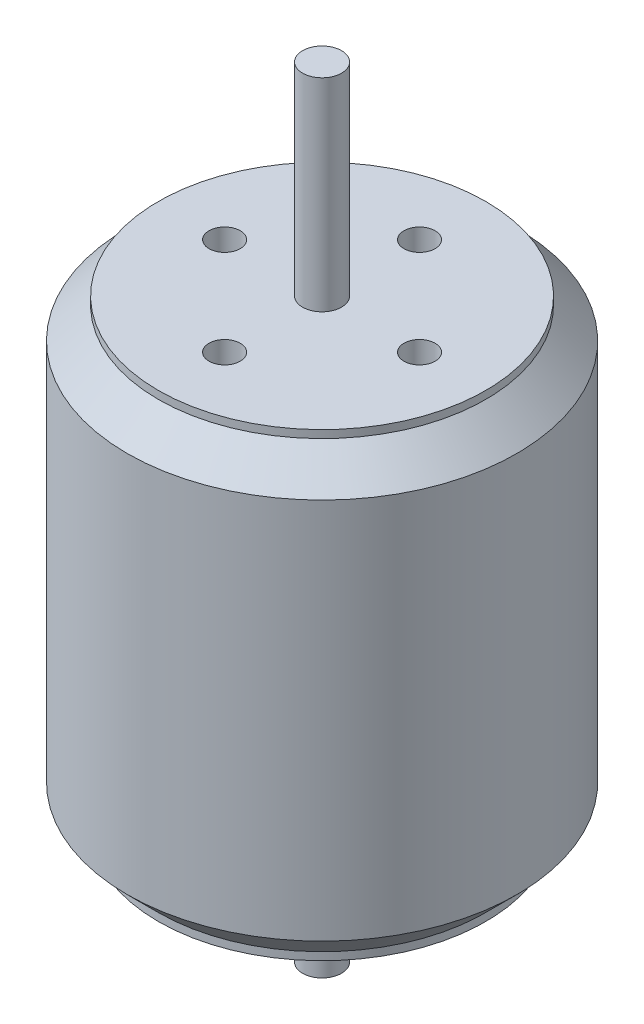
ISO-10303-21;
HEADER;
FILE_DESCRIPTION(('STEP AP214'),'2;1');
FILE_NAME('part.step','',(''),(''),'','','');
FILE_SCHEMA(('AUTOMOTIVE_DESIGN { 1 0 10303 214 1 1 1 1 }'));
ENDSEC;
DATA;
#1=APPLICATION_CONTEXT('core data for automotive mechanical design processes');
#2=APPLICATION_PROTOCOL_DEFINITION('international standard','automotive_design',2000,#1);
#3=PRODUCT_CONTEXT('',#1,'mechanical');
#4=PRODUCT('Part','Part','',(#3));
#5=PRODUCT_RELATED_PRODUCT_CATEGORY('part','',(#4));
#6=PRODUCT_DEFINITION_FORMATION('','',#4);
#7=PRODUCT_DEFINITION_CONTEXT('part definition',#1,'design');
#8=PRODUCT_DEFINITION('design','',#6,#7);
#9=PRODUCT_DEFINITION_SHAPE('','',#8);
#10=(LENGTH_UNIT() NAMED_UNIT(*) SI_UNIT(.MILLI.,.METRE.));
#11=(NAMED_UNIT(*) PLANE_ANGLE_UNIT() SI_UNIT($,.RADIAN.));
#12=(NAMED_UNIT(*) SI_UNIT($,.STERADIAN.) SOLID_ANGLE_UNIT());
#13=UNCERTAINTY_MEASURE_WITH_UNIT(LENGTH_MEASURE(1.E-05),#10,'distance_accuracy_value','');
#14=(GEOMETRIC_REPRESENTATION_CONTEXT(3) GLOBAL_UNCERTAINTY_ASSIGNED_CONTEXT((#13)) GLOBAL_UNIT_ASSIGNED_CONTEXT((#10,
#11,#12)) REPRESENTATION_CONTEXT('',''));
#15=CARTESIAN_POINT('',(0.,0.,0.));
#16=DIRECTION('',(0.,0.,1.));
#17=DIRECTION('',(1.,0.,0.));
#18=AXIS2_PLACEMENT_3D('',#15,#16,#17);
#19=CARTESIAN_POINT('',(0.,-59.,0.));
#20=DIRECTION('',(0.,1.,0.));
#21=DIRECTION('',(0.,0.,1.));
#22=AXIS2_PLACEMENT_3D('',#19,#20,#21);
#23=CYLINDRICAL_SURFACE('',#22,21.);
#24=CARTESIAN_POINT('',(0.,-0.99999999999998,0.));
#25=DIRECTION('',(0.,1.,0.));
#26=DIRECTION('',(0.,0.,1.));
#27=AXIS2_PLACEMENT_3D('',#24,#25,#26);
#28=CIRCLE('',#27,21.);
#29=CARTESIAN_POINT('',(0.,-0.99999999999998,21.));
#30=VERTEX_POINT('',#29);
#31=EDGE_CURVE('E44',#30,#30,#28,.T.);
#32=ORIENTED_EDGE('',*,*,#31,.T.);
#33=EDGE_LOOP('',(#32));
#34=FACE_BOUND('',#33,.T.);
#35=CARTESIAN_POINT('',(0.,0.,0.));
#36=DIRECTION('',(0.,1.,0.));
#37=DIRECTION('',(0.,0.,1.));
#38=AXIS2_PLACEMENT_3D('',#35,#36,#37);
#39=CIRCLE('',#38,21.);
#40=CARTESIAN_POINT('',(0.,0.,21.));
#41=VERTEX_POINT('',#40);
#42=EDGE_CURVE('E52',#41,#41,#39,.T.);
#43=ORIENTED_EDGE('',*,*,#42,.F.);
#44=EDGE_LOOP('',(#43));
#45=FACE_BOUND('',#44,.T.);
#46=ADVANCED_FACE('F37',(#34,#45),#23,.T.);
#47=CARTESIAN_POINT('',(0.,0.,0.));
#48=DIRECTION('',(0.,1.,0.));
#49=DIRECTION('',(0.,0.,1.));
#50=AXIS2_PLACEMENT_3D('',#47,#48,#49);
#51=PLANE('',#50);
#52=CARTESIAN_POINT('',(-12.5,0.,0.));
#53=DIRECTION('',(0.,1.,0.));
#54=DIRECTION('',(0.,0.,1.));
#55=AXIS2_PLACEMENT_3D('',#52,#53,#54);
#56=CIRCLE('',#55,2.);
#57=CARTESIAN_POINT('',(-12.5,0.,2.));
#58=VERTEX_POINT('',#57);
#59=EDGE_CURVE('E83',#58,#58,#56,.T.);
#60=ORIENTED_EDGE('',*,*,#59,.F.);
#61=EDGE_LOOP('',(#60));
#62=FACE_BOUND('',#61,.T.);
#63=CARTESIAN_POINT('',(0.,0.,-12.5));
#64=DIRECTION('',(0.,1.,0.));
#65=DIRECTION('',(0.,0.,1.));
#66=AXIS2_PLACEMENT_3D('',#63,#64,#65);
#67=CIRCLE('',#66,2.);
#68=CARTESIAN_POINT('',(0.,0.,-10.5));
#69=VERTEX_POINT('',#68);
#70=EDGE_CURVE('E77',#69,#69,#67,.T.);
#71=ORIENTED_EDGE('',*,*,#70,.F.);
#72=EDGE_LOOP('',(#71));
#73=FACE_BOUND('',#72,.T.);
#74=CARTESIAN_POINT('',(12.5,0.,0.));
#75=DIRECTION('',(0.,1.,0.));
#76=DIRECTION('',(0.,0.,1.));
#77=AXIS2_PLACEMENT_3D('',#74,#75,#76);
#78=CIRCLE('',#77,2.);
#79=CARTESIAN_POINT('',(12.5,0.,1.99999999999999));
#80=VERTEX_POINT('',#79);
#81=EDGE_CURVE('E71',#80,#80,#78,.T.);
#82=ORIENTED_EDGE('',*,*,#81,.F.);
#83=EDGE_LOOP('',(#82));
#84=FACE_BOUND('',#83,.T.);
#85=CARTESIAN_POINT('',(0.,0.,12.5));
#86=DIRECTION('',(0.,1.,0.));
#87=DIRECTION('',(0.,0.,1.));
#88=AXIS2_PLACEMENT_3D('',#85,#86,#87);
#89=CIRCLE('',#88,2.);
#90=CARTESIAN_POINT('',(0.,0.,14.5));
#91=VERTEX_POINT('',#90);
#92=EDGE_CURVE('E64',#91,#91,#89,.T.);
#93=ORIENTED_EDGE('',*,*,#92,.F.);
#94=EDGE_LOOP('',(#93));
#95=FACE_BOUND('',#94,.T.);
#96=CARTESIAN_POINT('',(0.,0.,0.));
#97=DIRECTION('',(0.,1.,0.));
#98=DIRECTION('',(0.,0.,1.));
#99=AXIS2_PLACEMENT_3D('',#96,#97,#98);
#100=CIRCLE('',#99,2.5);
#101=CARTESIAN_POINT('',(0.,0.,-2.5));
#102=VERTEX_POINT('',#101);
#103=EDGE_CURVE('E58',#102,#102,#100,.T.);
#104=ORIENTED_EDGE('',*,*,#103,.F.);
#105=EDGE_LOOP('',(#104));
#106=FACE_BOUND('',#105,.T.);
#107=ORIENTED_EDGE('',*,*,#42,.T.);
#108=EDGE_LOOP('',(#107));
#109=FACE_BOUND('',#108,.T.);
#110=ADVANCED_FACE('F111',(#62,#73,#84,#95,#106,#109),#51,.T.);
#111=CARTESIAN_POINT('',(0.,26.,0.));
#112=DIRECTION('',(0.,-1.,0.));
#113=DIRECTION('',(0.,0.,-1.));
#114=AXIS2_PLACEMENT_3D('',#111,#112,#113);
#115=CYLINDRICAL_SURFACE('',#114,2.5);
#116=CARTESIAN_POINT('',(0.,26.,0.));
#117=DIRECTION('',(0.,1.,0.));
#118=DIRECTION('',(0.,0.,1.));
#119=AXIS2_PLACEMENT_3D('',#116,#117,#118);
#120=CIRCLE('',#119,2.5);
#121=CARTESIAN_POINT('',(0.,26.,-2.5));
#122=VERTEX_POINT('',#121);
#123=EDGE_CURVE('E56',#122,#122,#120,.T.);
#124=CARTESIAN_POINT('',(0.,26.,-2.5));
#125=CARTESIAN_POINT('',(0.,25.7291666666667,-2.5));
#126=CARTESIAN_POINT('',(0.,25.4583333333333,-2.5));
#127=CARTESIAN_POINT('',(0.,24.9166666666667,-2.5));
#128=CARTESIAN_POINT('',(0.,24.6458333333333,-2.5));
#129=CARTESIAN_POINT('',(0.,24.1041666666667,-2.5));
#130=CARTESIAN_POINT('',(0.,23.8333333333333,-2.5));
#131=CARTESIAN_POINT('',(0.,23.2916666666667,-2.5));
#132=CARTESIAN_POINT('',(0.,23.0208333333333,-2.5));
#133=CARTESIAN_POINT('',(0.,22.4791666666667,-2.5));
#134=CARTESIAN_POINT('',(0.,22.2083333333333,-2.5));
#135=CARTESIAN_POINT('',(0.,21.6666666666667,-2.5));
#136=CARTESIAN_POINT('',(0.,21.3958333333333,-2.5));
#137=CARTESIAN_POINT('',(0.,20.8541666666667,-2.5));
#138=CARTESIAN_POINT('',(0.,20.5833333333333,-2.5));
#139=CARTESIAN_POINT('',(0.,20.0416666666667,-2.5));
#140=CARTESIAN_POINT('',(0.,19.7708333333333,-2.5));
#141=CARTESIAN_POINT('',(0.,19.2291666666667,-2.5));
#142=CARTESIAN_POINT('',(0.,18.9583333333333,-2.5));
#143=CARTESIAN_POINT('',(0.,18.4166666666667,-2.5));
#144=CARTESIAN_POINT('',(0.,18.1458333333333,-2.5));
#145=CARTESIAN_POINT('',(0.,17.6041666666667,-2.5));
#146=CARTESIAN_POINT('',(0.,17.3333333333333,-2.5));
#147=CARTESIAN_POINT('',(0.,16.7916666666667,-2.5));
#148=CARTESIAN_POINT('',(0.,16.5208333333333,-2.5));
#149=CARTESIAN_POINT('',(0.,15.9791666666667,-2.5));
#150=CARTESIAN_POINT('',(0.,15.7083333333333,-2.5));
#151=CARTESIAN_POINT('',(0.,15.1666666666667,-2.5));
#152=CARTESIAN_POINT('',(0.,14.8958333333333,-2.5));
#153=CARTESIAN_POINT('',(0.,14.3541666666667,-2.5));
#154=CARTESIAN_POINT('',(0.,14.0833333333333,-2.5));
#155=CARTESIAN_POINT('',(0.,13.5416666666667,-2.5));
#156=CARTESIAN_POINT('',(0.,13.2708333333333,-2.5));
#157=CARTESIAN_POINT('',(0.,12.7291666666667,-2.5));
#158=CARTESIAN_POINT('',(0.,12.4583333333333,-2.5));
#159=CARTESIAN_POINT('',(0.,11.9166666666667,-2.5));
#160=CARTESIAN_POINT('',(0.,11.6458333333333,-2.5));
#161=CARTESIAN_POINT('',(0.,11.1041666666667,-2.5));
#162=CARTESIAN_POINT('',(0.,10.8333333333333,-2.5));
#163=CARTESIAN_POINT('',(0.,10.2916666666667,-2.5));
#164=CARTESIAN_POINT('',(0.,10.0208333333333,-2.5));
#165=CARTESIAN_POINT('',(0.,9.47916666666667,-2.5));
#166=CARTESIAN_POINT('',(0.,9.20833333333333,-2.5));
#167=CARTESIAN_POINT('',(0.,8.66666666666667,-2.5));
#168=CARTESIAN_POINT('',(0.,8.39583333333333,-2.5));
#169=CARTESIAN_POINT('',(0.,7.85416666666667,-2.5));
#170=CARTESIAN_POINT('',(0.,7.58333333333333,-2.5));
#171=CARTESIAN_POINT('',(0.,7.04166666666667,-2.5));
#172=CARTESIAN_POINT('',(0.,6.77083333333333,-2.5));
#173=CARTESIAN_POINT('',(0.,6.22916666666667,-2.5));
#174=CARTESIAN_POINT('',(0.,5.95833333333333,-2.5));
#175=CARTESIAN_POINT('',(0.,5.41666666666667,-2.5));
#176=CARTESIAN_POINT('',(0.,5.14583333333333,-2.5));
#177=CARTESIAN_POINT('',(0.,4.60416666666667,-2.5));
#178=CARTESIAN_POINT('',(0.,4.33333333333333,-2.5));
#179=CARTESIAN_POINT('',(0.,3.79166666666667,-2.5));
#180=CARTESIAN_POINT('',(0.,3.52083333333333,-2.5));
#181=CARTESIAN_POINT('',(0.,2.97916666666667,-2.5));
#182=CARTESIAN_POINT('',(0.,2.70833333333333,-2.5));
#183=CARTESIAN_POINT('',(0.,2.16666666666667,-2.5));
#184=CARTESIAN_POINT('',(0.,1.89583333333333,-2.5));
#185=CARTESIAN_POINT('',(0.,1.35416666666667,-2.5));
#186=CARTESIAN_POINT('',(0.,1.08333333333333,-2.5));
#187=CARTESIAN_POINT('',(0.,0.541666666666667,-2.5));
#188=CARTESIAN_POINT('',(0.,0.270833333333334,-2.5));
#189=CARTESIAN_POINT('',(0.,0.,-2.5));
#190=B_SPLINE_CURVE_WITH_KNOTS('',3,(#124,#125,#126,#127,#128,#129,#130,#131,#132,#133,#134,
#135,#136,#137,#138,#139,#140,#141,#142,#143,#144,#145,#146,#147,#148,#149,#150,#151,#152,#153,
#154,#155,#156,#157,#158,#159,#160,#161,#162,#163,#164,#165,#166,#167,#168,#169,#170,#171,#172,
#173,#174,#175,#176,#177,#178,#179,#180,#181,#182,#183,#184,#185,#186,#187,#188,#189),
.UNSPECIFIED.,.F.,.F.,(4,2,2,2,2,2,2,2,2,2,2,2,2,2,2,2,2,2,2,2,2,2,2,2,2,2,2,2,2,2,2,2,4),(0.,
0.812500000000001,1.625,2.4375,3.25,4.0625,4.875,5.6875,6.5,7.3125,8.125,8.9375,9.75,10.5625,
11.375,12.1875,13.,13.8125,14.625,15.4375,16.25,17.0625,17.875,18.6875,19.5,20.3125,21.125,
21.9375,22.75,23.5625,24.375,25.1875,26.),.UNSPECIFIED.);
#191=EDGE_CURVE('BSEAM117',#122,#102,#190,.T.);
#192=ORIENTED_EDGE('',*,*,#123,.F.);
#193=ORIENTED_EDGE('',*,*,#103,.T.);
#194=ORIENTED_EDGE('',*,*,#191,.T.);
#195=ORIENTED_EDGE('',*,*,#191,.F.);
#196=EDGE_LOOP('',(#192,#194,#193,#195));
#197=FACE_BOUND('',#196,.T.);
#198=ADVANCED_FACE('F117',(#197),#115,.T.);
#199=CARTESIAN_POINT('',(0.,26.,0.));
#200=DIRECTION('',(0.,1.,0.));
#201=DIRECTION('',(0.,0.,1.));
#202=AXIS2_PLACEMENT_3D('',#199,#200,#201);
#203=PLANE('',#202);
#204=ORIENTED_EDGE('',*,*,#123,.T.);
#205=EDGE_LOOP('',(#204));
#206=FACE_BOUND('',#205,.T.);
#207=ADVANCED_FACE('F146',(#206),#203,.T.);
#208=CARTESIAN_POINT('',(0.,-10.,12.5));
#209=DIRECTION('',(0.,1.,0.));
#210=DIRECTION('',(0.,0.,1.));
#211=AXIS2_PLACEMENT_3D('',#208,#209,#210);
#212=CYLINDRICAL_SURFACE('',#211,2.);
#213=CARTESIAN_POINT('',(0.,-10.,12.5));
#214=DIRECTION('',(0.,1.,0.));
#215=DIRECTION('',(0.,0.,1.));
#216=AXIS2_PLACEMENT_3D('',#213,#214,#215);
#217=CIRCLE('',#216,2.);
#218=CARTESIAN_POINT('',(0.,-10.,14.5));
#219=VERTEX_POINT('',#218);
#220=EDGE_CURVE('E67',#219,#219,#217,.T.);
#221=ORIENTED_EDGE('',*,*,#220,.F.);
#222=EDGE_LOOP('',(#221));
#223=FACE_BOUND('',#222,.T.);
#224=ORIENTED_EDGE('',*,*,#92,.T.);
#225=EDGE_LOOP('',(#224));
#226=FACE_BOUND('',#225,.T.);
#227=ADVANCED_FACE('F150',(#223,#226),#212,.F.);
#228=CARTESIAN_POINT('',(0.,-10.,0.));
#229=DIRECTION('',(0.,1.,0.));
#230=DIRECTION('',(0.,0.,1.));
#231=AXIS2_PLACEMENT_3D('',#228,#229,#230);
#232=PLANE('',#231);
#233=ORIENTED_EDGE('',*,*,#220,.T.);
#234=EDGE_LOOP('',(#233));
#235=FACE_BOUND('',#234,.T.);
#236=ADVANCED_FACE('F154',(#235),#232,.T.);
#237=CARTESIAN_POINT('',(12.5,-10.,0.));
#238=DIRECTION('',(0.,1.,0.));
#239=DIRECTION('',(0.,0.,1.));
#240=AXIS2_PLACEMENT_3D('',#237,#238,#239);
#241=CYLINDRICAL_SURFACE('',#240,2.);
#242=CARTESIAN_POINT('',(12.5,-10.,0.));
#243=DIRECTION('',(0.,1.,0.));
#244=DIRECTION('',(0.,0.,1.));
#245=AXIS2_PLACEMENT_3D('',#242,#243,#244);
#246=CIRCLE('',#245,2.);
#247=CARTESIAN_POINT('',(12.5,-10.,1.99999999999999));
#248=VERTEX_POINT('',#247);
#249=EDGE_CURVE('E74',#248,#248,#246,.T.);
#250=ORIENTED_EDGE('',*,*,#249,.F.);
#251=EDGE_LOOP('',(#250));
#252=FACE_BOUND('',#251,.T.);
#253=ORIENTED_EDGE('',*,*,#81,.T.);
#254=EDGE_LOOP('',(#253));
#255=FACE_BOUND('',#254,.T.);
#256=ADVANCED_FACE('F158',(#252,#255),#241,.F.);
#257=CARTESIAN_POINT('',(0.,-10.,0.));
#258=DIRECTION('',(0.,1.,0.));
#259=DIRECTION('',(0.,0.,1.));
#260=AXIS2_PLACEMENT_3D('',#257,#258,#259);
#261=PLANE('',#260);
#262=ORIENTED_EDGE('',*,*,#249,.T.);
#263=EDGE_LOOP('',(#262));
#264=FACE_BOUND('',#263,.T.);
#265=ADVANCED_FACE('F162',(#264),#261,.T.);
#266=CARTESIAN_POINT('',(0.,-10.,-12.5));
#267=DIRECTION('',(0.,1.,0.));
#268=DIRECTION('',(0.,0.,1.));
#269=AXIS2_PLACEMENT_3D('',#266,#267,#268);
#270=CYLINDRICAL_SURFACE('',#269,2.);
#271=CARTESIAN_POINT('',(0.,-10.,-12.5));
#272=DIRECTION('',(0.,1.,0.));
#273=DIRECTION('',(0.,0.,1.));
#274=AXIS2_PLACEMENT_3D('',#271,#272,#273);
#275=CIRCLE('',#274,2.);
#276=CARTESIAN_POINT('',(0.,-10.,-10.5));
#277=VERTEX_POINT('',#276);
#278=EDGE_CURVE('E80',#277,#277,#275,.T.);
#279=ORIENTED_EDGE('',*,*,#278,.F.);
#280=EDGE_LOOP('',(#279));
#281=FACE_BOUND('',#280,.T.);
#282=ORIENTED_EDGE('',*,*,#70,.T.);
#283=EDGE_LOOP('',(#282));
#284=FACE_BOUND('',#283,.T.);
#285=ADVANCED_FACE('F166',(#281,#284),#270,.F.);
#286=CARTESIAN_POINT('',(0.,-10.,0.));
#287=DIRECTION('',(0.,1.,0.));
#288=DIRECTION('',(0.,0.,1.));
#289=AXIS2_PLACEMENT_3D('',#286,#287,#288);
#290=PLANE('',#289);
#291=ORIENTED_EDGE('',*,*,#278,.T.);
#292=EDGE_LOOP('',(#291));
#293=FACE_BOUND('',#292,.T.);
#294=ADVANCED_FACE('F170',(#293),#290,.T.);
#295=CARTESIAN_POINT('',(-12.5,-10.,0.));
#296=DIRECTION('',(0.,1.,0.));
#297=DIRECTION('',(0.,0.,1.));
#298=AXIS2_PLACEMENT_3D('',#295,#296,#297);
#299=CYLINDRICAL_SURFACE('',#298,2.);
#300=CARTESIAN_POINT('',(-12.5,-10.,0.));
#301=DIRECTION('',(0.,1.,0.));
#302=DIRECTION('',(0.,0.,1.));
#303=AXIS2_PLACEMENT_3D('',#300,#301,#302);
#304=CIRCLE('',#303,2.);
#305=CARTESIAN_POINT('',(-12.5,-10.,2.));
#306=VERTEX_POINT('',#305);
#307=EDGE_CURVE('E61',#306,#306,#304,.T.);
#308=ORIENTED_EDGE('',*,*,#307,.F.);
#309=EDGE_LOOP('',(#308));
#310=FACE_BOUND('',#309,.T.);
#311=ORIENTED_EDGE('',*,*,#59,.T.);
#312=EDGE_LOOP('',(#311));
#313=FACE_BOUND('',#312,.T.);
#314=ADVANCED_FACE('F174',(#310,#313),#299,.F.);
#315=CARTESIAN_POINT('',(0.,-10.,0.));
#316=DIRECTION('',(0.,1.,0.));
#317=DIRECTION('',(0.,0.,1.));
#318=AXIS2_PLACEMENT_3D('',#315,#316,#317);
#319=PLANE('',#318);
#320=ORIENTED_EDGE('',*,*,#307,.T.);
#321=EDGE_LOOP('',(#320));
#322=FACE_BOUND('',#321,.T.);
#323=ADVANCED_FACE('F140',(#322),#319,.T.);
#324=CARTESIAN_POINT('',(0.,-129.710678118655,0.));
#325=DIRECTION('',(0.,1.,0.));
#326=DIRECTION('',(0.,0.,1.));
#327=AXIS2_PLACEMENT_3D('',#324,#325,#326);
#328=CYLINDRICAL_SURFACE('',#327,25.);
#329=CARTESIAN_POINT('',(0.,-54.,0.));
#330=DIRECTION('',(0.,1.,0.));
#331=DIRECTION('',(0.,0.,1.));
#332=AXIS2_PLACEMENT_3D('',#329,#330,#331);
#333=CIRCLE('',#332,25.);
#334=CARTESIAN_POINT('',(0.,-54.,25.));
#335=VERTEX_POINT('',#334);
#336=EDGE_CURVE('E68',#335,#335,#333,.F.);
#337=CARTESIAN_POINT('',(0.,-5.,0.));
#338=DIRECTION('',(0.,1.,0.));
#339=DIRECTION('',(0.,0.,1.));
#340=AXIS2_PLACEMENT_3D('',#337,#338,#339);
#341=CIRCLE('',#340,25.);
#342=CARTESIAN_POINT('',(0.,-4.99999999999999,25.));
#343=VERTEX_POINT('',#342);
#344=EDGE_CURVE('E90',#343,#343,#341,.T.);
#345=CARTESIAN_POINT('',(0.,-54.,25.));
#346=CARTESIAN_POINT('',(0.,-53.4895833333333,25.));
#347=CARTESIAN_POINT('',(0.,-52.9791666666667,25.));
#348=CARTESIAN_POINT('',(0.,-51.9583333333333,25.));
#349=CARTESIAN_POINT('',(0.,-51.4479166666667,25.));
#350=CARTESIAN_POINT('',(0.,-50.4270833333333,25.));
#351=CARTESIAN_POINT('',(0.,-49.9166666666667,25.));
#352=CARTESIAN_POINT('',(0.,-48.8958333333333,25.));
#353=CARTESIAN_POINT('',(0.,-48.3854166666667,25.));
#354=CARTESIAN_POINT('',(0.,-47.3645833333333,25.));
#355=CARTESIAN_POINT('',(0.,-46.8541666666667,25.));
#356=CARTESIAN_POINT('',(0.,-45.8333333333333,25.));
#357=CARTESIAN_POINT('',(0.,-45.3229166666667,25.));
#358=CARTESIAN_POINT('',(0.,-44.3020833333333,25.));
#359=CARTESIAN_POINT('',(0.,-43.7916666666667,25.));
#360=CARTESIAN_POINT('',(0.,-42.7708333333333,25.));
#361=CARTESIAN_POINT('',(0.,-42.2604166666667,25.));
#362=CARTESIAN_POINT('',(0.,-41.2395833333333,25.));
#363=CARTESIAN_POINT('',(0.,-40.7291666666667,25.));
#364=CARTESIAN_POINT('',(0.,-39.7083333333333,25.));
#365=CARTESIAN_POINT('',(0.,-39.1979166666667,25.));
#366=CARTESIAN_POINT('',(0.,-38.1770833333333,25.));
#367=CARTESIAN_POINT('',(0.,-37.6666666666667,25.));
#368=CARTESIAN_POINT('',(0.,-36.6458333333333,25.));
#369=CARTESIAN_POINT('',(0.,-36.1354166666667,25.));
#370=CARTESIAN_POINT('',(0.,-35.1145833333333,25.));
#371=CARTESIAN_POINT('',(0.,-34.6041666666667,25.));
#372=CARTESIAN_POINT('',(0.,-33.5833333333333,25.));
#373=CARTESIAN_POINT('',(0.,-33.0729166666667,25.));
#374=CARTESIAN_POINT('',(0.,-32.0520833333333,25.));
#375=CARTESIAN_POINT('',(0.,-31.5416666666667,25.));
#376=CARTESIAN_POINT('',(0.,-30.5208333333333,25.));
#377=CARTESIAN_POINT('',(0.,-30.0104166666667,25.));
#378=CARTESIAN_POINT('',(0.,-28.9895833333333,25.));
#379=CARTESIAN_POINT('',(0.,-28.4791666666667,25.));
#380=CARTESIAN_POINT('',(0.,-27.4583333333333,25.));
#381=CARTESIAN_POINT('',(0.,-26.9479166666667,25.));
#382=CARTESIAN_POINT('',(0.,-25.9270833333333,25.));
#383=CARTESIAN_POINT('',(0.,-25.4166666666667,25.));
#384=CARTESIAN_POINT('',(0.,-24.3958333333333,25.));
#385=CARTESIAN_POINT('',(0.,-23.8854166666667,25.));
#386=CARTESIAN_POINT('',(0.,-22.8645833333333,25.));
#387=CARTESIAN_POINT('',(0.,-22.3541666666667,25.));
#388=CARTESIAN_POINT('',(0.,-21.3333333333333,25.));
#389=CARTESIAN_POINT('',(0.,-20.8229166666667,25.));
#390=CARTESIAN_POINT('',(0.,-19.8020833333333,25.));
#391=CARTESIAN_POINT('',(0.,-19.2916666666667,25.));
#392=CARTESIAN_POINT('',(0.,-18.2708333333333,25.));
#393=CARTESIAN_POINT('',(0.,-17.7604166666667,25.));
#394=CARTESIAN_POINT('',(0.,-16.7395833333333,25.));
#395=CARTESIAN_POINT('',(0.,-16.2291666666667,25.));
#396=CARTESIAN_POINT('',(0.,-15.2083333333333,25.));
#397=CARTESIAN_POINT('',(0.,-14.6979166666667,25.));
#398=CARTESIAN_POINT('',(0.,-13.6770833333333,25.));
#399=CARTESIAN_POINT('',(0.,-13.1666666666667,25.));
#400=CARTESIAN_POINT('',(0.,-12.1458333333333,25.));
#401=CARTESIAN_POINT('',(0.,-11.6354166666667,25.));
#402=CARTESIAN_POINT('',(0.,-10.6145833333333,25.));
#403=CARTESIAN_POINT('',(0.,-10.1041666666667,25.));
#404=CARTESIAN_POINT('',(0.,-9.08333333333333,25.));
#405=CARTESIAN_POINT('',(0.,-8.57291666666666,25.));
#406=CARTESIAN_POINT('',(0.,-7.55208333333332,25.));
#407=CARTESIAN_POINT('',(0.,-7.04166666666665,25.));
#408=CARTESIAN_POINT('',(0.,-6.02083333333332,25.));
#409=CARTESIAN_POINT('',(0.,-5.51041666666666,25.));
#410=CARTESIAN_POINT('',(0.,-4.99999999999999,25.));
#411=B_SPLINE_CURVE_WITH_KNOTS('',3,(#345,#346,#347,#348,#349,#350,#351,#352,#353,#354,#355,
#356,#357,#358,#359,#360,#361,#362,#363,#364,#365,#366,#367,#368,#369,#370,#371,#372,#373,#374,
#375,#376,#377,#378,#379,#380,#381,#382,#383,#384,#385,#386,#387,#388,#389,#390,#391,#392,#393,
#394,#395,#396,#397,#398,#399,#400,#401,#402,#403,#404,#405,#406,#407,#408,#409,#410),
.UNSPECIFIED.,.F.,.F.,(4,2,2,2,2,2,2,2,2,2,2,2,2,2,2,2,2,2,2,2,2,2,2,2,2,2,2,2,2,2,2,2,4),(0.,
1.53125,3.0625,4.59375000000001,6.12500000000001,7.65625,9.1875,10.71875,12.25,13.78125,15.3125,
16.84375,18.375,19.90625,21.4375,22.96875,24.5,26.03125,27.5625,29.09375,30.625,32.15625,
33.6875,35.21875,36.75,38.28125,39.8125,41.34375,42.875,44.40625,45.9375,47.46875,49.),.UNSPECIFIED.);
#412=EDGE_CURVE('BSEAM130',#335,#343,#411,.T.);
#413=ORIENTED_EDGE('',*,*,#336,.F.);
#414=ORIENTED_EDGE('',*,*,#344,.F.);
#415=ORIENTED_EDGE('',*,*,#412,.T.);
#416=ORIENTED_EDGE('',*,*,#412,.F.);
#417=EDGE_LOOP('',(#413,#415,#414,#416));
#418=FACE_BOUND('',#417,.T.);
#419=ADVANCED_FACE('F130',(#418),#328,.T.);
#420=CARTESIAN_POINT('',(0.,-59.,0.));
#421=DIRECTION('',(0.,1.,0.));
#422=DIRECTION('',(0.,0.,1.));
#423=AXIS2_PLACEMENT_3D('',#420,#421,#422);
#424=PLANE('',#423);
#425=CARTESIAN_POINT('',(0.,-59.,0.));
#426=DIRECTION('',(0.,1.,0.));
#427=DIRECTION('',(0.,0.,1.));
#428=AXIS2_PLACEMENT_3D('',#425,#426,#427);
#429=CIRCLE('',#428,2.5);
#430=CARTESIAN_POINT('',(0.,-59.,2.5));
#431=VERTEX_POINT('',#430);
#432=EDGE_CURVE('E94',#431,#431,#429,.T.);
#433=ORIENTED_EDGE('',*,*,#432,.T.);
#434=EDGE_LOOP('',(#433));
#435=FACE_BOUND('',#434,.T.);
#436=CARTESIAN_POINT('',(0.,-59.,0.));
#437=DIRECTION('',(0.,1.,0.));
#438=DIRECTION('',(0.,0.,1.));
#439=AXIS2_PLACEMENT_3D('',#436,#437,#438);
#440=CIRCLE('',#439,21.);
#441=CARTESIAN_POINT('',(0.,-59.,21.));
#442=VERTEX_POINT('',#441);
#443=EDGE_CURVE('E48',#442,#442,#440,.T.);
#444=ORIENTED_EDGE('',*,*,#443,.F.);
#445=EDGE_LOOP('',(#444));
#446=FACE_BOUND('',#445,.T.);
#447=ADVANCED_FACE('F123',(#435,#446),#424,.F.);
#448=CARTESIAN_POINT('',(0.,-58.,0.));
#449=DIRECTION('',(0.,1.,0.));
#450=DIRECTION('',(0.,0.,1.));
#451=AXIS2_PLACEMENT_3D('',#448,#449,#450);
#452=CIRCLE('',#451,21.);
#453=CARTESIAN_POINT('',(0.,-58.,21.));
#454=VERTEX_POINT('',#453);
#455=EDGE_CURVE('E11',#454,#454,#452,.F.);
#456=ORIENTED_EDGE('',*,*,#455,.T.);
#457=EDGE_LOOP('',(#456));
#458=FACE_BOUND('',#457,.T.);
#459=ORIENTED_EDGE('',*,*,#443,.T.);
#460=EDGE_LOOP('',(#459));
#461=FACE_BOUND('',#460,.T.);
#462=ADVANCED_FACE('F113',(#458,#461),#23,.T.);
#463=CARTESIAN_POINT('',(0.,-5.,0.));
#464=DIRECTION('',(0.,-1.,0.));
#465=DIRECTION('',(0.,0.,-1.));
#466=AXIS2_PLACEMENT_3D('',#463,#464,#465);
#467=CONICAL_SURFACE('',#466,25.0000000000001,0.785398163397453);
#468=ORIENTED_EDGE('',*,*,#31,.F.);
#469=EDGE_LOOP('',(#468));
#470=FACE_BOUND('',#469,.T.);
#471=ORIENTED_EDGE('',*,*,#344,.T.);
#472=EDGE_LOOP('',(#471));
#473=FACE_BOUND('',#472,.T.);
#474=ADVANCED_FACE('F122',(#470,#473),#467,.T.);
#475=CARTESIAN_POINT('',(0.,-58.,0.));
#476=DIRECTION('',(0.,1.,0.));
#477=DIRECTION('',(0.,0.,1.));
#478=AXIS2_PLACEMENT_3D('',#475,#476,#477);
#479=CONICAL_SURFACE('',#478,21.,0.785398163397442);
#480=ORIENTED_EDGE('',*,*,#336,.T.);
#481=EDGE_LOOP('',(#480));
#482=FACE_BOUND('',#481,.T.);
#483=ORIENTED_EDGE('',*,*,#455,.F.);
#484=EDGE_LOOP('',(#483));
#485=FACE_BOUND('',#484,.T.);
#486=ADVANCED_FACE('F39',(#482,#485),#479,.T.);
#487=CARTESIAN_POINT('',(0.,-74.,0.));
#488=DIRECTION('',(0.,1.,0.));
#489=DIRECTION('',(0.,0.,1.));
#490=AXIS2_PLACEMENT_3D('',#487,#488,#489);
#491=CYLINDRICAL_SURFACE('',#490,2.5);
#492=CARTESIAN_POINT('',(0.,-74.,0.));
#493=DIRECTION('',(0.,1.,0.));
#494=DIRECTION('',(0.,0.,1.));
#495=AXIS2_PLACEMENT_3D('',#492,#493,#494);
#496=CIRCLE('',#495,2.5);
#497=CARTESIAN_POINT('',(0.,-74.,2.5));
#498=VERTEX_POINT('',#497);
#499=EDGE_CURVE('E93',#498,#498,#496,.T.);
#500=ORIENTED_EDGE('',*,*,#499,.T.);
#501=EDGE_LOOP('',(#500));
#502=FACE_BOUND('',#501,.T.);
#503=ORIENTED_EDGE('',*,*,#432,.F.);
#504=EDGE_LOOP('',(#503));
#505=FACE_BOUND('',#504,.T.);
#506=ADVANCED_FACE('F100',(#502,#505),#491,.T.);
#507=CARTESIAN_POINT('',(0.,-74.,0.));
#508=DIRECTION('',(0.,1.,0.));
#509=DIRECTION('',(0.,0.,1.));
#510=AXIS2_PLACEMENT_3D('',#507,#508,#509);
#511=PLANE('',#510);
#512=ORIENTED_EDGE('',*,*,#499,.F.);
#513=EDGE_LOOP('',(#512));
#514=FACE_BOUND('',#513,.T.);
#515=ADVANCED_FACE('F103',(#514),#511,.F.);
#516=CLOSED_SHELL('',(#46,#110,#198,#207,#227,#236,#256,#265,#285,#294,#314,#323,#419,#447,#462,
#474,#486,#506,#515));
#517=MANIFOLD_SOLID_BREP('B2',#516);
#518=ADVANCED_BREP_SHAPE_REPRESENTATION('',(#18,#517),#14);
#519=SHAPE_DEFINITION_REPRESENTATION(#9,#518);
ENDSEC;
END-ISO-10303-21;
